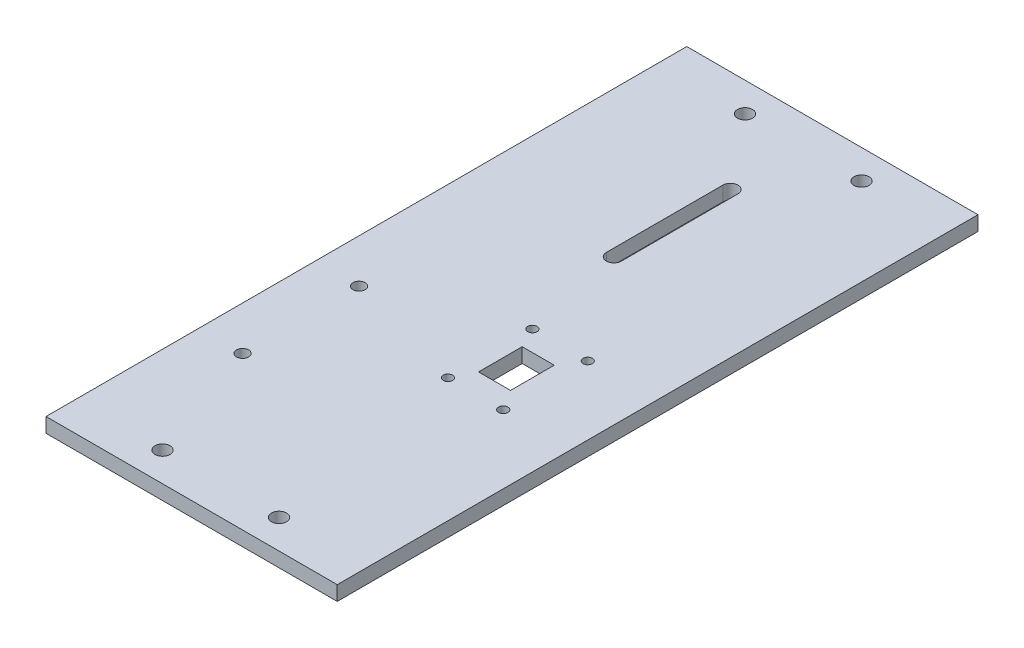
ISO-10303-21;
HEADER;
FILE_DESCRIPTION(('STEP AP214'),'2;1');
FILE_NAME('part.step','',(''),(''),'','','');
FILE_SCHEMA(('AUTOMOTIVE_DESIGN { 1 0 10303 214 1 1 1 1 }'));
ENDSEC;
DATA;
#1=APPLICATION_CONTEXT('core data for automotive mechanical design processes');
#2=APPLICATION_PROTOCOL_DEFINITION('international standard','automotive_design',2000,#1);
#3=PRODUCT_CONTEXT('',#1,'mechanical');
#4=PRODUCT('Part','Part','',(#3));
#5=PRODUCT_RELATED_PRODUCT_CATEGORY('part','',(#4));
#6=PRODUCT_DEFINITION_FORMATION('','',#4);
#7=PRODUCT_DEFINITION_CONTEXT('part definition',#1,'design');
#8=PRODUCT_DEFINITION('design','',#6,#7);
#9=PRODUCT_DEFINITION_SHAPE('','',#8);
#10=(LENGTH_UNIT() NAMED_UNIT(*) SI_UNIT(.MILLI.,.METRE.));
#11=(NAMED_UNIT(*) PLANE_ANGLE_UNIT() SI_UNIT($,.RADIAN.));
#12=(NAMED_UNIT(*) SI_UNIT($,.STERADIAN.) SOLID_ANGLE_UNIT());
#13=UNCERTAINTY_MEASURE_WITH_UNIT(LENGTH_MEASURE(1.E-05),#10,'distance_accuracy_value','');
#14=(GEOMETRIC_REPRESENTATION_CONTEXT(3) GLOBAL_UNCERTAINTY_ASSIGNED_CONTEXT((#13)) GLOBAL_UNIT_ASSIGNED_CONTEXT((#10,
#11,#12)) REPRESENTATION_CONTEXT('',''));
#15=CARTESIAN_POINT('',(0.,0.,0.));
#16=DIRECTION('',(0.,0.,1.));
#17=DIRECTION('',(1.,0.,0.));
#18=AXIS2_PLACEMENT_3D('',#15,#16,#17);
#19=CARTESIAN_POINT('',(50.,5.,110.));
#20=DIRECTION('',(-1.,0.,0.));
#21=DIRECTION('',(0.,0.,1.));
#22=AXIS2_PLACEMENT_3D('',#19,#20,#21);
#23=PLANE('',#22);
#24=DIRECTION('',(0.,0.,-1.));
#25=VECTOR('',#24,1.);
#26=CARTESIAN_POINT('',(50.,0.,110.));
#27=LINE('',#26,#25);
#28=CARTESIAN_POINT('',(50.,0.,110.));
#29=VERTEX_POINT('',#28);
#30=CARTESIAN_POINT('',(50.,0.,-110.));
#31=VERTEX_POINT('',#30);
#32=EDGE_CURVE('E207',#29,#31,#27,.T.);
#33=ORIENTED_EDGE('',*,*,#32,.T.);
#34=DIRECTION('',(0.,-1.,0.));
#35=VECTOR('',#34,1.);
#36=CARTESIAN_POINT('',(50.,5.,-110.));
#37=LINE('',#36,#35);
#38=CARTESIAN_POINT('',(50.,5.,-110.));
#39=VERTEX_POINT('',#38);
#40=EDGE_CURVE('E179',#39,#31,#37,.T.);
#41=ORIENTED_EDGE('',*,*,#40,.F.);
#42=DIRECTION('',(0.,0.,-1.));
#43=VECTOR('',#42,1.);
#44=CARTESIAN_POINT('',(50.,5.,110.));
#45=LINE('',#44,#43);
#46=CARTESIAN_POINT('',(50.,5.,110.));
#47=VERTEX_POINT('',#46);
#48=EDGE_CURVE('E203',#47,#39,#45,.T.);
#49=ORIENTED_EDGE('',*,*,#48,.F.);
#50=DIRECTION('',(0.,-1.,0.));
#51=VECTOR('',#50,1.);
#52=CARTESIAN_POINT('',(50.,5.,110.));
#53=LINE('',#52,#51);
#54=EDGE_CURVE('E196',#47,#29,#53,.T.);
#55=ORIENTED_EDGE('',*,*,#54,.T.);
#56=EDGE_LOOP('',(#33,#41,#49,#55));
#57=FACE_BOUND('',#56,.T.);
#58=ADVANCED_FACE('F40',(#57),#23,.F.);
#59=CARTESIAN_POINT('',(-50.,5.,-110.));
#60=DIRECTION('',(0.,0.,1.));
#61=DIRECTION('',(1.,0.,0.));
#62=AXIS2_PLACEMENT_3D('',#59,#60,#61);
#63=PLANE('',#62);
#64=DIRECTION('',(-1.,0.,0.));
#65=VECTOR('',#64,1.);
#66=CARTESIAN_POINT('',(-50.,0.,-110.));
#67=LINE('',#66,#65);
#68=CARTESIAN_POINT('',(-50.,0.,-110.));
#69=VERTEX_POINT('',#68);
#70=EDGE_CURVE('E205',#31,#69,#67,.T.);
#71=ORIENTED_EDGE('',*,*,#70,.T.);
#72=DIRECTION('',(0.,-1.,0.));
#73=VECTOR('',#72,1.);
#74=CARTESIAN_POINT('',(-50.,5.,-110.));
#75=LINE('',#74,#73);
#76=CARTESIAN_POINT('',(-50.,5.,-110.));
#77=VERTEX_POINT('',#76);
#78=EDGE_CURVE('E190',#77,#69,#75,.T.);
#79=ORIENTED_EDGE('',*,*,#78,.F.);
#80=DIRECTION('',(-1.,0.,0.));
#81=VECTOR('',#80,1.);
#82=CARTESIAN_POINT('',(-50.,5.,-110.));
#83=LINE('',#82,#81);
#84=EDGE_CURVE('E214',#39,#77,#83,.T.);
#85=ORIENTED_EDGE('',*,*,#84,.F.);
#86=ORIENTED_EDGE('',*,*,#40,.T.);
#87=EDGE_LOOP('',(#71,#79,#85,#86));
#88=FACE_BOUND('',#87,.T.);
#89=ADVANCED_FACE('F302',(#88),#63,.F.);
#90=CARTESIAN_POINT('',(-50.,5.,110.));
#91=DIRECTION('',(1.,0.,0.));
#92=DIRECTION('',(0.,0.,-1.));
#93=AXIS2_PLACEMENT_3D('',#90,#91,#92);
#94=PLANE('',#93);
#95=DIRECTION('',(0.,0.,1.));
#96=VECTOR('',#95,1.);
#97=CARTESIAN_POINT('',(-50.,0.,110.));
#98=LINE('',#97,#96);
#99=CARTESIAN_POINT('',(-50.,0.,110.));
#100=VERTEX_POINT('',#99);
#101=EDGE_CURVE('E202',#69,#100,#98,.T.);
#102=ORIENTED_EDGE('',*,*,#101,.T.);
#103=DIRECTION('',(0.,-1.,0.));
#104=VECTOR('',#103,1.);
#105=CARTESIAN_POINT('',(-50.,5.,110.));
#106=LINE('',#105,#104);
#107=CARTESIAN_POINT('',(-50.,5.,110.));
#108=VERTEX_POINT('',#107);
#109=EDGE_CURVE('E193',#108,#100,#106,.T.);
#110=ORIENTED_EDGE('',*,*,#109,.F.);
#111=DIRECTION('',(0.,0.,1.));
#112=VECTOR('',#111,1.);
#113=CARTESIAN_POINT('',(-50.,5.,110.));
#114=LINE('',#113,#112);
#115=EDGE_CURVE('E212',#77,#108,#114,.T.);
#116=ORIENTED_EDGE('',*,*,#115,.F.);
#117=ORIENTED_EDGE('',*,*,#78,.T.);
#118=EDGE_LOOP('',(#102,#110,#116,#117));
#119=FACE_BOUND('',#118,.T.);
#120=ADVANCED_FACE('F309',(#119),#94,.F.);
#121=CARTESIAN_POINT('',(-50.,5.,110.));
#122=DIRECTION('',(0.,0.,-1.));
#123=DIRECTION('',(-1.,0.,0.));
#124=AXIS2_PLACEMENT_3D('',#121,#122,#123);
#125=PLANE('',#124);
#126=DIRECTION('',(1.,0.,0.));
#127=VECTOR('',#126,1.);
#128=CARTESIAN_POINT('',(-50.,0.,110.));
#129=LINE('',#128,#127);
#130=EDGE_CURVE('E200',#100,#29,#129,.T.);
#131=ORIENTED_EDGE('',*,*,#130,.T.);
#132=ORIENTED_EDGE('',*,*,#54,.F.);
#133=DIRECTION('',(1.,0.,0.));
#134=VECTOR('',#133,1.);
#135=CARTESIAN_POINT('',(-50.,5.,110.));
#136=LINE('',#135,#134);
#137=EDGE_CURVE('E199',#108,#47,#136,.T.);
#138=ORIENTED_EDGE('',*,*,#137,.F.);
#139=ORIENTED_EDGE('',*,*,#109,.T.);
#140=EDGE_LOOP('',(#131,#132,#138,#139));
#141=FACE_BOUND('',#140,.T.);
#142=ADVANCED_FACE('F316',(#141),#125,.F.);
#143=CARTESIAN_POINT('',(0.,0.,0.));
#144=DIRECTION('',(0.,-1.,0.));
#145=DIRECTION('',(0.,0.,-1.));
#146=AXIS2_PLACEMENT_3D('',#143,#144,#145);
#147=PLANE('',#146);
#148=CARTESIAN_POINT('',(7.5,0.,29.5));
#149=DIRECTION('',(0.,-1.,0.));
#150=DIRECTION('',(0.,0.,-1.));
#151=AXIS2_PLACEMENT_3D('',#148,#149,#150);
#152=CIRCLE('',#151,1.6);
#153=CARTESIAN_POINT('',(7.5,0.,27.9));
#154=VERTEX_POINT('',#153);
#155=EDGE_CURVE('E585',#154,#154,#152,.F.);
#156=ORIENTED_EDGE('',*,*,#155,.T.);
#157=EDGE_LOOP('',(#156));
#158=FACE_BOUND('',#157,.T.);
#159=CARTESIAN_POINT('',(26.5,0.,0.500000000000011));
#160=DIRECTION('',(0.,-1.,0.));
#161=DIRECTION('',(0.,0.,-1.));
#162=AXIS2_PLACEMENT_3D('',#159,#160,#161);
#163=CIRCLE('',#162,1.6);
#164=CARTESIAN_POINT('',(26.5,0.,-1.09999999999999));
#165=VERTEX_POINT('',#164);
#166=EDGE_CURVE('E569',#165,#165,#163,.F.);
#167=ORIENTED_EDGE('',*,*,#166,.T.);
#168=EDGE_LOOP('',(#167));
#169=FACE_BOUND('',#168,.T.);
#170=CARTESIAN_POINT('',(7.5,0.,0.500000000000011));
#171=DIRECTION('',(0.,-1.,0.));
#172=DIRECTION('',(0.,0.,-1.));
#173=AXIS2_PLACEMENT_3D('',#170,#171,#172);
#174=CIRCLE('',#173,1.6);
#175=CARTESIAN_POINT('',(7.5,0.,-1.09999999999999));
#176=VERTEX_POINT('',#175);
#177=EDGE_CURVE('E573',#176,#176,#174,.F.);
#178=ORIENTED_EDGE('',*,*,#177,.T.);
#179=EDGE_LOOP('',(#178));
#180=FACE_BOUND('',#179,.T.);
#181=CARTESIAN_POINT('',(26.5,0.,29.5));
#182=DIRECTION('',(0.,-1.,0.));
#183=DIRECTION('',(0.,0.,-1.));
#184=AXIS2_PLACEMENT_3D('',#181,#182,#183);
#185=CIRCLE('',#184,1.6);
#186=CARTESIAN_POINT('',(26.5,0.,27.9));
#187=VERTEX_POINT('',#186);
#188=EDGE_CURVE('E583',#187,#187,#185,.F.);
#189=ORIENTED_EDGE('',*,*,#188,.T.);
#190=EDGE_LOOP('',(#189));
#191=FACE_BOUND('',#190,.T.);
#192=DIRECTION('',(0.,0.,-1.));
#193=VECTOR('',#192,1.);
#194=CARTESIAN_POINT('',(-2.6,0.,-35.));
#195=LINE('',#194,#193);
#196=CARTESIAN_POINT('',(-2.6,0.,-35.));
#197=VERTEX_POINT('',#196);
#198=CARTESIAN_POINT('',(-2.59999999999999,0.,-75.));
#199=VERTEX_POINT('',#198);
#200=EDGE_CURVE('E130',#197,#199,#195,.T.);
#201=ORIENTED_EDGE('',*,*,#200,.F.);
#202=CARTESIAN_POINT('',(0.,0.,-35.));
#203=DIRECTION('',(0.,-1.,0.));
#204=DIRECTION('',(0.,0.,-1.));
#205=AXIS2_PLACEMENT_3D('',#202,#203,#204);
#206=CIRCLE('',#205,2.6);
#207=CARTESIAN_POINT('',(2.6,0.,-35.));
#208=VERTEX_POINT('',#207);
#209=EDGE_CURVE('E135',#208,#197,#206,.T.);
#210=ORIENTED_EDGE('',*,*,#209,.F.);
#211=DIRECTION('',(0.,0.,1.));
#212=VECTOR('',#211,1.);
#213=CARTESIAN_POINT('',(2.6,0.,-35.));
#214=LINE('',#213,#212);
#215=CARTESIAN_POINT('',(2.6,0.,-75.));
#216=VERTEX_POINT('',#215);
#217=EDGE_CURVE('E141',#216,#208,#214,.T.);
#218=ORIENTED_EDGE('',*,*,#217,.F.);
#219=CARTESIAN_POINT('',(0.,0.,-75.));
#220=DIRECTION('',(0.,-1.,0.));
#221=DIRECTION('',(0.,0.,-1.));
#222=AXIS2_PLACEMENT_3D('',#219,#220,#221);
#223=CIRCLE('',#222,2.6);
#224=EDGE_CURVE('E137',#199,#216,#223,.T.);
#225=ORIENTED_EDGE('',*,*,#224,.F.);
#226=EDGE_LOOP('',(#201,#210,#218,#225));
#227=FACE_BOUND('',#226,.T.);
#228=CARTESIAN_POINT('',(-35.,0.,57.5));
#229=DIRECTION('',(0.,-1.,0.));
#230=DIRECTION('',(0.,0.,-1.));
#231=AXIS2_PLACEMENT_3D('',#228,#229,#230);
#232=CIRCLE('',#231,2.1);
#233=CARTESIAN_POINT('',(-35.,0.,55.4));
#234=VERTEX_POINT('',#233);
#235=EDGE_CURVE('E180',#234,#234,#232,.F.);
#236=ORIENTED_EDGE('',*,*,#235,.T.);
#237=EDGE_LOOP('',(#236));
#238=FACE_BOUND('',#237,.T.);
#239=CARTESIAN_POINT('',(-35.,0.,17.5));
#240=DIRECTION('',(0.,-1.,0.));
#241=DIRECTION('',(0.,0.,-1.));
#242=AXIS2_PLACEMENT_3D('',#239,#240,#241);
#243=CIRCLE('',#242,2.1);
#244=CARTESIAN_POINT('',(-35.,0.,15.4));
#245=VERTEX_POINT('',#244);
#246=EDGE_CURVE('E183',#245,#245,#243,.F.);
#247=ORIENTED_EDGE('',*,*,#246,.T.);
#248=EDGE_LOOP('',(#247));
#249=FACE_BOUND('',#248,.T.);
#250=DIRECTION('',(0.,0.,-1.));
#251=VECTOR('',#250,1.);
#252=CARTESIAN_POINT('',(22.,0.,7.50000000000002));
#253=LINE('',#252,#251);
#254=CARTESIAN_POINT('',(22.,0.,22.5));
#255=VERTEX_POINT('',#254);
#256=CARTESIAN_POINT('',(22.,0.,7.50000000000002));
#257=VERTEX_POINT('',#256);
#258=EDGE_CURVE('E261',#255,#257,#253,.T.);
#259=ORIENTED_EDGE('',*,*,#258,.T.);
#260=DIRECTION('',(-1.,0.,0.));
#261=VECTOR('',#260,1.);
#262=CARTESIAN_POINT('',(11.,0.,7.50000000000003));
#263=LINE('',#262,#261);
#264=CARTESIAN_POINT('',(11.,0.,7.50000000000003));
#265=VERTEX_POINT('',#264);
#266=EDGE_CURVE('E55',#257,#265,#263,.T.);
#267=ORIENTED_EDGE('',*,*,#266,.T.);
#268=DIRECTION('',(0.,0.,1.));
#269=VECTOR('',#268,1.);
#270=CARTESIAN_POINT('',(11.,0.,7.50000000000003));
#271=LINE('',#270,#269);
#272=CARTESIAN_POINT('',(11.,0.,22.5));
#273=VERTEX_POINT('',#272);
#274=EDGE_CURVE('E11',#265,#273,#271,.T.);
#275=ORIENTED_EDGE('',*,*,#274,.T.);
#276=DIRECTION('',(1.,0.,0.));
#277=VECTOR('',#276,1.);
#278=CARTESIAN_POINT('',(11.,0.,22.5));
#279=LINE('',#278,#277);
#280=EDGE_CURVE('E48',#273,#255,#279,.T.);
#281=ORIENTED_EDGE('',*,*,#280,.T.);
#282=EDGE_LOOP('',(#259,#267,#275,#281));
#283=FACE_BOUND('',#282,.T.);
#284=CARTESIAN_POINT('',(-20.,0.,100.));
#285=DIRECTION('',(0.,-1.,0.));
#286=DIRECTION('',(0.,0.,-1.));
#287=AXIS2_PLACEMENT_3D('',#284,#285,#286);
#288=CIRCLE('',#287,2.6);
#289=CARTESIAN_POINT('',(-20.,0.,97.4));
#290=VERTEX_POINT('',#289);
#291=EDGE_CURVE('E221',#290,#290,#288,.F.);
#292=ORIENTED_EDGE('',*,*,#291,.T.);
#293=EDGE_LOOP('',(#292));
#294=FACE_BOUND('',#293,.T.);
#295=CARTESIAN_POINT('',(20.,0.,-100.));
#296=DIRECTION('',(0.,-1.,0.));
#297=DIRECTION('',(0.,0.,-1.));
#298=AXIS2_PLACEMENT_3D('',#295,#296,#297);
#299=CIRCLE('',#298,2.6);
#300=CARTESIAN_POINT('',(20.,0.,-102.6));
#301=VERTEX_POINT('',#300);
#302=EDGE_CURVE('E228',#301,#301,#299,.F.);
#303=ORIENTED_EDGE('',*,*,#302,.T.);
#304=EDGE_LOOP('',(#303));
#305=FACE_BOUND('',#304,.T.);
#306=CARTESIAN_POINT('',(20.0000000000001,0.,100.));
#307=DIRECTION('',(0.,-1.,0.));
#308=DIRECTION('',(0.,0.,-1.));
#309=AXIS2_PLACEMENT_3D('',#306,#307,#308);
#310=CIRCLE('',#309,2.6);
#311=CARTESIAN_POINT('',(20.0000000000001,0.,97.4));
#312=VERTEX_POINT('',#311);
#313=EDGE_CURVE('E227',#312,#312,#310,.F.);
#314=ORIENTED_EDGE('',*,*,#313,.T.);
#315=EDGE_LOOP('',(#314));
#316=FACE_BOUND('',#315,.T.);
#317=CARTESIAN_POINT('',(-20.,0.,-100.));
#318=DIRECTION('',(0.,-1.,0.));
#319=DIRECTION('',(0.,0.,-1.));
#320=AXIS2_PLACEMENT_3D('',#317,#318,#319);
#321=CIRCLE('',#320,2.6);
#322=CARTESIAN_POINT('',(-20.,0.,-102.6));
#323=VERTEX_POINT('',#322);
#324=EDGE_CURVE('E218',#323,#323,#321,.F.);
#325=ORIENTED_EDGE('',*,*,#324,.T.);
#326=EDGE_LOOP('',(#325));
#327=FACE_BOUND('',#326,.T.);
#328=ORIENTED_EDGE('',*,*,#32,.F.);
#329=ORIENTED_EDGE('',*,*,#130,.F.);
#330=ORIENTED_EDGE('',*,*,#101,.F.);
#331=ORIENTED_EDGE('',*,*,#70,.F.);
#332=EDGE_LOOP('',(#328,#329,#330,#331));
#333=FACE_BOUND('',#332,.T.);
#334=ADVANCED_FACE('F132',(#158,#169,#180,#191,#227,#238,#249,#283,#294,#305,#316,#327,#333),
#147,.T.);
#335=CARTESIAN_POINT('',(-20.,-0.00100000000000013,-100.));
#336=DIRECTION('',(0.,1.,0.));
#337=DIRECTION('',(0.,0.,1.));
#338=AXIS2_PLACEMENT_3D('',#335,#336,#337);
#339=CYLINDRICAL_SURFACE('',#338,2.6);
#340=ORIENTED_EDGE('',*,*,#324,.F.);
#341=EDGE_LOOP('',(#340));
#342=FACE_BOUND('',#341,.T.);
#343=CARTESIAN_POINT('',(-20.,5.,-100.));
#344=DIRECTION('',(0.,1.,0.));
#345=DIRECTION('',(0.,0.,1.));
#346=AXIS2_PLACEMENT_3D('',#343,#344,#345);
#347=CIRCLE('',#346,2.6);
#348=CARTESIAN_POINT('',(-20.,5.,-97.4));
#349=VERTEX_POINT('',#348);
#350=EDGE_CURVE('E210',#349,#349,#347,.T.);
#351=ORIENTED_EDGE('',*,*,#350,.T.);
#352=EDGE_LOOP('',(#351));
#353=FACE_BOUND('',#352,.T.);
#354=ADVANCED_FACE('F323',(#342,#353),#339,.F.);
#355=CARTESIAN_POINT('',(20.0000000000001,-0.00100000000000013,100.));
#356=DIRECTION('',(0.,1.,0.));
#357=DIRECTION('',(0.,0.,1.));
#358=AXIS2_PLACEMENT_3D('',#355,#356,#357);
#359=CYLINDRICAL_SURFACE('',#358,2.6);
#360=ORIENTED_EDGE('',*,*,#313,.F.);
#361=EDGE_LOOP('',(#360));
#362=FACE_BOUND('',#361,.T.);
#363=CARTESIAN_POINT('',(20.0000000000001,5.,100.));
#364=DIRECTION('',(0.,1.,0.));
#365=DIRECTION('',(0.,0.,1.));
#366=AXIS2_PLACEMENT_3D('',#363,#364,#365);
#367=CIRCLE('',#366,2.6);
#368=CARTESIAN_POINT('',(20.0000000000001,5.,102.6));
#369=VERTEX_POINT('',#368);
#370=EDGE_CURVE('E236',#369,#369,#367,.T.);
#371=ORIENTED_EDGE('',*,*,#370,.T.);
#372=EDGE_LOOP('',(#371));
#373=FACE_BOUND('',#372,.T.);
#374=ADVANCED_FACE('F327',(#362,#373),#359,.F.);
#375=CARTESIAN_POINT('',(20.,-0.00100000000000013,-100.));
#376=DIRECTION('',(0.,1.,0.));
#377=DIRECTION('',(0.,0.,1.));
#378=AXIS2_PLACEMENT_3D('',#375,#376,#377);
#379=CYLINDRICAL_SURFACE('',#378,2.6);
#380=ORIENTED_EDGE('',*,*,#302,.F.);
#381=EDGE_LOOP('',(#380));
#382=FACE_BOUND('',#381,.T.);
#383=CARTESIAN_POINT('',(20.,5.,-100.));
#384=DIRECTION('',(0.,1.,0.));
#385=DIRECTION('',(0.,0.,1.));
#386=AXIS2_PLACEMENT_3D('',#383,#384,#385);
#387=CIRCLE('',#386,2.6);
#388=CARTESIAN_POINT('',(20.,5.,-97.4));
#389=VERTEX_POINT('',#388);
#390=EDGE_CURVE('E224',#389,#389,#387,.T.);
#391=ORIENTED_EDGE('',*,*,#390,.T.);
#392=EDGE_LOOP('',(#391));
#393=FACE_BOUND('',#392,.T.);
#394=ADVANCED_FACE('F329',(#382,#393),#379,.F.);
#395=CARTESIAN_POINT('',(-20.,-0.00100000000000013,100.));
#396=DIRECTION('',(0.,1.,0.));
#397=DIRECTION('',(0.,0.,1.));
#398=AXIS2_PLACEMENT_3D('',#395,#396,#397);
#399=CYLINDRICAL_SURFACE('',#398,2.6);
#400=ORIENTED_EDGE('',*,*,#291,.F.);
#401=EDGE_LOOP('',(#400));
#402=FACE_BOUND('',#401,.T.);
#403=CARTESIAN_POINT('',(-20.,5.,100.));
#404=DIRECTION('',(0.,1.,0.));
#405=DIRECTION('',(0.,0.,1.));
#406=AXIS2_PLACEMENT_3D('',#403,#404,#405);
#407=CIRCLE('',#406,2.6);
#408=CARTESIAN_POINT('',(-20.,5.,102.6));
#409=VERTEX_POINT('',#408);
#410=EDGE_CURVE('E231',#409,#409,#407,.T.);
#411=ORIENTED_EDGE('',*,*,#410,.T.);
#412=EDGE_LOOP('',(#411));
#413=FACE_BOUND('',#412,.T.);
#414=ADVANCED_FACE('F332',(#402,#413),#399,.F.);
#415=CARTESIAN_POINT('',(22.,-0.00100000000000013,7.50000000000002));
#416=DIRECTION('',(1.,0.,0.));
#417=DIRECTION('',(0.,0.,-1.));
#418=AXIS2_PLACEMENT_3D('',#415,#416,#417);
#419=PLANE('',#418);
#420=DIRECTION('',(0.,1.,0.));
#421=VECTOR('',#420,1.);
#422=CARTESIAN_POINT('',(22.,-0.00100000000000013,22.5));
#423=LINE('',#422,#421);
#424=CARTESIAN_POINT('',(22.,5.,22.5));
#425=VERTEX_POINT('',#424);
#426=EDGE_CURVE('E242',#255,#425,#423,.T.);
#427=ORIENTED_EDGE('',*,*,#426,.T.);
#428=DIRECTION('',(0.,0.,-1.));
#429=VECTOR('',#428,1.);
#430=CARTESIAN_POINT('',(22.,5.,7.50000000000002));
#431=LINE('',#430,#429);
#432=CARTESIAN_POINT('',(22.,5.,7.50000000000002));
#433=VERTEX_POINT('',#432);
#434=EDGE_CURVE('E259',#425,#433,#431,.T.);
#435=ORIENTED_EDGE('',*,*,#434,.T.);
#436=DIRECTION('',(0.,1.,0.));
#437=VECTOR('',#436,1.);
#438=CARTESIAN_POINT('',(22.,-0.00100000000000013,7.50000000000002));
#439=LINE('',#438,#437);
#440=EDGE_CURVE('E243',#257,#433,#439,.T.);
#441=ORIENTED_EDGE('',*,*,#440,.F.);
#442=ORIENTED_EDGE('',*,*,#258,.F.);
#443=EDGE_LOOP('',(#427,#435,#441,#442));
#444=FACE_BOUND('',#443,.T.);
#445=ADVANCED_FACE('F276',(#444),#419,.F.);
#446=CARTESIAN_POINT('',(11.,-0.00100000000000013,22.5));
#447=DIRECTION('',(0.,0.,1.));
#448=DIRECTION('',(1.,0.,0.));
#449=AXIS2_PLACEMENT_3D('',#446,#447,#448);
#450=PLANE('',#449);
#451=DIRECTION('',(0.,1.,0.));
#452=VECTOR('',#451,1.);
#453=CARTESIAN_POINT('',(11.,-0.00100000000000013,22.5));
#454=LINE('',#453,#452);
#455=CARTESIAN_POINT('',(11.,5.,22.5));
#456=VERTEX_POINT('',#455);
#457=EDGE_CURVE('E248',#273,#456,#454,.T.);
#458=ORIENTED_EDGE('',*,*,#457,.T.);
#459=DIRECTION('',(1.,0.,0.));
#460=VECTOR('',#459,1.);
#461=CARTESIAN_POINT('',(11.,5.,22.5));
#462=LINE('',#461,#460);
#463=EDGE_CURVE('E245',#456,#425,#462,.T.);
#464=ORIENTED_EDGE('',*,*,#463,.T.);
#465=ORIENTED_EDGE('',*,*,#426,.F.);
#466=ORIENTED_EDGE('',*,*,#280,.F.);
#467=EDGE_LOOP('',(#458,#464,#465,#466));
#468=FACE_BOUND('',#467,.T.);
#469=ADVANCED_FACE('F270',(#468),#450,.F.);
#470=CARTESIAN_POINT('',(11.,-0.00100000000000013,7.50000000000003));
#471=DIRECTION('',(-1.,0.,0.));
#472=DIRECTION('',(0.,0.,1.));
#473=AXIS2_PLACEMENT_3D('',#470,#471,#472);
#474=PLANE('',#473);
#475=DIRECTION('',(0.,1.,0.));
#476=VECTOR('',#475,1.);
#477=CARTESIAN_POINT('',(11.,-0.00100000000000013,7.50000000000003));
#478=LINE('',#477,#476);
#479=CARTESIAN_POINT('',(11.,5.,7.50000000000003));
#480=VERTEX_POINT('',#479);
#481=EDGE_CURVE('E246',#265,#480,#478,.T.);
#482=ORIENTED_EDGE('',*,*,#481,.T.);
#483=DIRECTION('',(0.,0.,1.));
#484=VECTOR('',#483,1.);
#485=CARTESIAN_POINT('',(11.,5.,7.50000000000003));
#486=LINE('',#485,#484);
#487=EDGE_CURVE('E253',#480,#456,#486,.T.);
#488=ORIENTED_EDGE('',*,*,#487,.T.);
#489=ORIENTED_EDGE('',*,*,#457,.F.);
#490=ORIENTED_EDGE('',*,*,#274,.F.);
#491=EDGE_LOOP('',(#482,#488,#489,#490));
#492=FACE_BOUND('',#491,.T.);
#493=ADVANCED_FACE('F267',(#492),#474,.F.);
#494=CARTESIAN_POINT('',(11.,-0.00100000000000013,7.50000000000003));
#495=DIRECTION('',(0.,0.,-1.));
#496=DIRECTION('',(-1.,0.,0.));
#497=AXIS2_PLACEMENT_3D('',#494,#495,#496);
#498=PLANE('',#497);
#499=ORIENTED_EDGE('',*,*,#440,.T.);
#500=DIRECTION('',(-1.,0.,0.));
#501=VECTOR('',#500,1.);
#502=CARTESIAN_POINT('',(11.,5.,7.50000000000003));
#503=LINE('',#502,#501);
#504=EDGE_CURVE('E256',#433,#480,#503,.T.);
#505=ORIENTED_EDGE('',*,*,#504,.T.);
#506=ORIENTED_EDGE('',*,*,#481,.F.);
#507=ORIENTED_EDGE('',*,*,#266,.F.);
#508=EDGE_LOOP('',(#499,#505,#506,#507));
#509=FACE_BOUND('',#508,.T.);
#510=ADVANCED_FACE('F277',(#509),#498,.F.);
#511=CARTESIAN_POINT('',(-35.,-0.00100000000000013,17.5));
#512=DIRECTION('',(0.,1.,0.));
#513=DIRECTION('',(0.,0.,1.));
#514=AXIS2_PLACEMENT_3D('',#511,#512,#513);
#515=CYLINDRICAL_SURFACE('',#514,2.1);
#516=ORIENTED_EDGE('',*,*,#246,.F.);
#517=EDGE_LOOP('',(#516));
#518=FACE_BOUND('',#517,.T.);
#519=CARTESIAN_POINT('',(-35.,5.,17.5));
#520=DIRECTION('',(0.,1.,0.));
#521=DIRECTION('',(0.,0.,1.));
#522=AXIS2_PLACEMENT_3D('',#519,#520,#521);
#523=CIRCLE('',#522,2.1);
#524=CARTESIAN_POINT('',(-35.,5.,19.6));
#525=VERTEX_POINT('',#524);
#526=EDGE_CURVE('E175',#525,#525,#523,.T.);
#527=ORIENTED_EDGE('',*,*,#526,.T.);
#528=EDGE_LOOP('',(#527));
#529=FACE_BOUND('',#528,.T.);
#530=ADVANCED_FACE('F279',(#518,#529),#515,.F.);
#531=CARTESIAN_POINT('',(-35.,-0.00100000000000013,57.5));
#532=DIRECTION('',(0.,1.,0.));
#533=DIRECTION('',(0.,0.,1.));
#534=AXIS2_PLACEMENT_3D('',#531,#532,#533);
#535=CYLINDRICAL_SURFACE('',#534,2.1);
#536=ORIENTED_EDGE('',*,*,#235,.F.);
#537=EDGE_LOOP('',(#536));
#538=FACE_BOUND('',#537,.T.);
#539=CARTESIAN_POINT('',(-35.,5.,57.5));
#540=DIRECTION('',(0.,1.,0.));
#541=DIRECTION('',(0.,0.,1.));
#542=AXIS2_PLACEMENT_3D('',#539,#540,#541);
#543=CIRCLE('',#542,2.1);
#544=CARTESIAN_POINT('',(-35.,5.,59.6));
#545=VERTEX_POINT('',#544);
#546=EDGE_CURVE('E176',#545,#545,#543,.T.);
#547=ORIENTED_EDGE('',*,*,#546,.T.);
#548=EDGE_LOOP('',(#547));
#549=FACE_BOUND('',#548,.T.);
#550=ADVANCED_FACE('F285',(#538,#549),#535,.F.);
#551=CARTESIAN_POINT('',(2.6,30.001,-35.));
#552=DIRECTION('',(1.,0.,0.));
#553=DIRECTION('',(0.,0.,-1.));
#554=AXIS2_PLACEMENT_3D('',#551,#552,#553);
#555=PLANE('',#554);
#556=ORIENTED_EDGE('',*,*,#217,.T.);
#557=DIRECTION('',(0.,-1.,0.));
#558=VECTOR('',#557,1.);
#559=CARTESIAN_POINT('',(2.6,30.001,-35.));
#560=LINE('',#559,#558);
#561=CARTESIAN_POINT('',(2.6,5.,-35.));
#562=VERTEX_POINT('',#561);
#563=EDGE_CURVE('E152',#562,#208,#560,.T.);
#564=ORIENTED_EDGE('',*,*,#563,.F.);
#565=DIRECTION('',(0.,0.,1.));
#566=VECTOR('',#565,1.);
#567=CARTESIAN_POINT('',(2.6,5.,-35.));
#568=LINE('',#567,#566);
#569=CARTESIAN_POINT('',(2.6,5.,-75.));
#570=VERTEX_POINT('',#569);
#571=EDGE_CURVE('E142',#570,#562,#568,.T.);
#572=ORIENTED_EDGE('',*,*,#571,.F.);
#573=DIRECTION('',(0.,-1.,0.));
#574=VECTOR('',#573,1.);
#575=CARTESIAN_POINT('',(2.6,30.001,-75.));
#576=LINE('',#575,#574);
#577=EDGE_CURVE('E167',#570,#216,#576,.T.);
#578=ORIENTED_EDGE('',*,*,#577,.T.);
#579=EDGE_LOOP('',(#556,#564,#572,#578));
#580=FACE_BOUND('',#579,.T.);
#581=ADVANCED_FACE('F374',(#580),#555,.F.);
#582=CARTESIAN_POINT('',(-2.6,30.001,-35.));
#583=DIRECTION('',(-1.,0.,0.));
#584=DIRECTION('',(0.,0.,1.));
#585=AXIS2_PLACEMENT_3D('',#582,#583,#584);
#586=PLANE('',#585);
#587=DIRECTION('',(0.,0.,-1.));
#588=VECTOR('',#587,1.);
#589=CARTESIAN_POINT('',(-2.6,5.,-35.));
#590=LINE('',#589,#588);
#591=CARTESIAN_POINT('',(-2.6,5.,-35.));
#592=VERTEX_POINT('',#591);
#593=CARTESIAN_POINT('',(-2.59999999999999,5.,-75.));
#594=VERTEX_POINT('',#593);
#595=EDGE_CURVE('E147',#592,#594,#590,.T.);
#596=ORIENTED_EDGE('',*,*,#595,.F.);
#597=DIRECTION('',(0.,-1.,0.));
#598=VECTOR('',#597,1.);
#599=CARTESIAN_POINT('',(-2.6,30.001,-35.));
#600=LINE('',#599,#598);
#601=EDGE_CURVE('E145',#592,#197,#600,.T.);
#602=ORIENTED_EDGE('',*,*,#601,.T.);
#603=ORIENTED_EDGE('',*,*,#200,.T.);
#604=DIRECTION('',(0.,-1.,0.));
#605=VECTOR('',#604,1.);
#606=CARTESIAN_POINT('',(-2.59999999999999,30.001,-75.));
#607=LINE('',#606,#605);
#608=EDGE_CURVE('E166',#594,#199,#607,.T.);
#609=ORIENTED_EDGE('',*,*,#608,.F.);
#610=EDGE_LOOP('',(#596,#602,#603,#609));
#611=FACE_BOUND('',#610,.T.);
#612=ADVANCED_FACE('F146',(#611),#586,.F.);
#613=CARTESIAN_POINT('',(0.,30.001,-75.));
#614=DIRECTION('',(0.,-1.,0.));
#615=DIRECTION('',(0.,0.,-1.));
#616=AXIS2_PLACEMENT_3D('',#613,#614,#615);
#617=CYLINDRICAL_SURFACE('',#616,2.6);
#618=ORIENTED_EDGE('',*,*,#608,.T.);
#619=ORIENTED_EDGE('',*,*,#224,.T.);
#620=ORIENTED_EDGE('',*,*,#577,.F.);
#621=CARTESIAN_POINT('',(0.,5.,-75.));
#622=DIRECTION('',(0.,1.,0.));
#623=DIRECTION('',(0.,0.,1.));
#624=AXIS2_PLACEMENT_3D('',#621,#622,#623);
#625=CIRCLE('',#624,2.6);
#626=EDGE_CURVE('E163',#594,#570,#625,.F.);
#627=ORIENTED_EDGE('',*,*,#626,.F.);
#628=EDGE_LOOP('',(#618,#619,#620,#627));
#629=FACE_BOUND('',#628,.T.);
#630=ADVANCED_FACE('F400',(#629),#617,.F.);
#631=CARTESIAN_POINT('',(0.,30.001,-35.));
#632=DIRECTION('',(0.,-1.,0.));
#633=DIRECTION('',(0.,0.,-1.));
#634=AXIS2_PLACEMENT_3D('',#631,#632,#633);
#635=CYLINDRICAL_SURFACE('',#634,2.6);
#636=ORIENTED_EDGE('',*,*,#563,.T.);
#637=ORIENTED_EDGE('',*,*,#209,.T.);
#638=ORIENTED_EDGE('',*,*,#601,.F.);
#639=CARTESIAN_POINT('',(0.,5.,-35.));
#640=DIRECTION('',(0.,1.,0.));
#641=DIRECTION('',(0.,0.,1.));
#642=AXIS2_PLACEMENT_3D('',#639,#640,#641);
#643=CIRCLE('',#642,2.6);
#644=EDGE_CURVE('E151',#562,#592,#643,.F.);
#645=ORIENTED_EDGE('',*,*,#644,.F.);
#646=EDGE_LOOP('',(#636,#637,#638,#645));
#647=FACE_BOUND('',#646,.T.);
#648=ADVANCED_FACE('F155',(#647),#635,.F.);
#649=CARTESIAN_POINT('',(26.5,-0.00100000000000013,29.5));
#650=DIRECTION('',(0.,1.,0.));
#651=DIRECTION('',(0.,0.,1.));
#652=AXIS2_PLACEMENT_3D('',#649,#650,#651);
#653=CYLINDRICAL_SURFACE('',#652,1.6);
#654=ORIENTED_EDGE('',*,*,#188,.F.);
#655=EDGE_LOOP('',(#654));
#656=FACE_BOUND('',#655,.T.);
#657=CARTESIAN_POINT('',(26.5,5.,29.5));
#658=DIRECTION('',(0.,1.,0.));
#659=DIRECTION('',(0.,0.,1.));
#660=AXIS2_PLACEMENT_3D('',#657,#658,#659);
#661=CIRCLE('',#660,1.6);
#662=CARTESIAN_POINT('',(26.5,5.,31.1));
#663=VERTEX_POINT('',#662);
#664=EDGE_CURVE('E171',#663,#663,#661,.T.);
#665=ORIENTED_EDGE('',*,*,#664,.T.);
#666=EDGE_LOOP('',(#665));
#667=FACE_BOUND('',#666,.T.);
#668=ADVANCED_FACE('F426',(#656,#667),#653,.F.);
#669=CARTESIAN_POINT('',(7.5,-0.00100000000000013,0.500000000000011));
#670=DIRECTION('',(0.,1.,0.));
#671=DIRECTION('',(0.,0.,1.));
#672=AXIS2_PLACEMENT_3D('',#669,#670,#671);
#673=CYLINDRICAL_SURFACE('',#672,1.6);
#674=ORIENTED_EDGE('',*,*,#177,.F.);
#675=EDGE_LOOP('',(#674));
#676=FACE_BOUND('',#675,.T.);
#677=CARTESIAN_POINT('',(7.5,5.,0.500000000000011));
#678=DIRECTION('',(0.,1.,0.));
#679=DIRECTION('',(0.,0.,1.));
#680=AXIS2_PLACEMENT_3D('',#677,#678,#679);
#681=CIRCLE('',#680,1.6);
#682=CARTESIAN_POINT('',(7.5,5.,2.10000000000001));
#683=VERTEX_POINT('',#682);
#684=EDGE_CURVE('E578',#683,#683,#681,.T.);
#685=ORIENTED_EDGE('',*,*,#684,.T.);
#686=EDGE_LOOP('',(#685));
#687=FACE_BOUND('',#686,.T.);
#688=ADVANCED_FACE('F436',(#676,#687),#673,.F.);
#689=CARTESIAN_POINT('',(26.5,-0.00100000000000013,0.500000000000011));
#690=DIRECTION('',(0.,1.,0.));
#691=DIRECTION('',(0.,0.,1.));
#692=AXIS2_PLACEMENT_3D('',#689,#690,#691);
#693=CYLINDRICAL_SURFACE('',#692,1.6);
#694=ORIENTED_EDGE('',*,*,#166,.F.);
#695=EDGE_LOOP('',(#694));
#696=FACE_BOUND('',#695,.T.);
#697=CARTESIAN_POINT('',(26.5,5.,0.500000000000011));
#698=DIRECTION('',(0.,1.,0.));
#699=DIRECTION('',(0.,0.,1.));
#700=AXIS2_PLACEMENT_3D('',#697,#698,#699);
#701=CIRCLE('',#700,1.6);
#702=CARTESIAN_POINT('',(26.5,5.,2.10000000000001));
#703=VERTEX_POINT('',#702);
#704=EDGE_CURVE('E572',#703,#703,#701,.T.);
#705=ORIENTED_EDGE('',*,*,#704,.T.);
#706=EDGE_LOOP('',(#705));
#707=FACE_BOUND('',#706,.T.);
#708=ADVANCED_FACE('F296',(#696,#707),#693,.F.);
#709=CARTESIAN_POINT('',(7.5,-0.00100000000000013,29.5));
#710=DIRECTION('',(0.,1.,0.));
#711=DIRECTION('',(0.,0.,1.));
#712=AXIS2_PLACEMENT_3D('',#709,#710,#711);
#713=CYLINDRICAL_SURFACE('',#712,1.6);
#714=ORIENTED_EDGE('',*,*,#155,.F.);
#715=EDGE_LOOP('',(#714));
#716=FACE_BOUND('',#715,.T.);
#717=CARTESIAN_POINT('',(7.5,5.,29.5));
#718=DIRECTION('',(0.,1.,0.));
#719=DIRECTION('',(0.,0.,1.));
#720=AXIS2_PLACEMENT_3D('',#717,#718,#719);
#721=CIRCLE('',#720,1.6);
#722=CARTESIAN_POINT('',(7.5,5.,31.1));
#723=VERTEX_POINT('',#722);
#724=EDGE_CURVE('E575',#723,#723,#721,.T.);
#725=ORIENTED_EDGE('',*,*,#724,.T.);
#726=EDGE_LOOP('',(#725));
#727=FACE_BOUND('',#726,.T.);
#728=ADVANCED_FACE('F291',(#716,#727),#713,.F.);
#729=CARTESIAN_POINT('',(50.,5.,-110.));
#730=DIRECTION('',(0.,1.,0.));
#731=DIRECTION('',(0.,0.,1.));
#732=AXIS2_PLACEMENT_3D('',#729,#730,#731);
#733=PLANE('',#732);
#734=ORIENTED_EDGE('',*,*,#724,.F.);
#735=EDGE_LOOP('',(#734));
#736=FACE_BOUND('',#735,.T.);
#737=ORIENTED_EDGE('',*,*,#704,.F.);
#738=EDGE_LOOP('',(#737));
#739=FACE_BOUND('',#738,.T.);
#740=ORIENTED_EDGE('',*,*,#684,.F.);
#741=EDGE_LOOP('',(#740));
#742=FACE_BOUND('',#741,.T.);
#743=ORIENTED_EDGE('',*,*,#664,.F.);
#744=EDGE_LOOP('',(#743));
#745=FACE_BOUND('',#744,.T.);
#746=ORIENTED_EDGE('',*,*,#644,.T.);
#747=ORIENTED_EDGE('',*,*,#595,.T.);
#748=ORIENTED_EDGE('',*,*,#626,.T.);
#749=ORIENTED_EDGE('',*,*,#571,.T.);
#750=EDGE_LOOP('',(#746,#747,#748,#749));
#751=FACE_BOUND('',#750,.T.);
#752=ORIENTED_EDGE('',*,*,#546,.F.);
#753=EDGE_LOOP('',(#752));
#754=FACE_BOUND('',#753,.T.);
#755=ORIENTED_EDGE('',*,*,#526,.F.);
#756=EDGE_LOOP('',(#755));
#757=FACE_BOUND('',#756,.T.);
#758=ORIENTED_EDGE('',*,*,#504,.F.);
#759=ORIENTED_EDGE('',*,*,#434,.F.);
#760=ORIENTED_EDGE('',*,*,#463,.F.);
#761=ORIENTED_EDGE('',*,*,#487,.F.);
#762=EDGE_LOOP('',(#758,#759,#760,#761));
#763=FACE_BOUND('',#762,.T.);
#764=ORIENTED_EDGE('',*,*,#410,.F.);
#765=EDGE_LOOP('',(#764));
#766=FACE_BOUND('',#765,.T.);
#767=ORIENTED_EDGE('',*,*,#390,.F.);
#768=EDGE_LOOP('',(#767));
#769=FACE_BOUND('',#768,.T.);
#770=ORIENTED_EDGE('',*,*,#370,.F.);
#771=EDGE_LOOP('',(#770));
#772=FACE_BOUND('',#771,.T.);
#773=ORIENTED_EDGE('',*,*,#350,.F.);
#774=EDGE_LOOP('',(#773));
#775=FACE_BOUND('',#774,.T.);
#776=ORIENTED_EDGE('',*,*,#48,.T.);
#777=ORIENTED_EDGE('',*,*,#84,.T.);
#778=ORIENTED_EDGE('',*,*,#115,.T.);
#779=ORIENTED_EDGE('',*,*,#137,.T.);
#780=EDGE_LOOP('',(#776,#777,#778,#779));
#781=FACE_BOUND('',#780,.T.);
#782=ADVANCED_FACE('F42',(#736,#739,#742,#745,#751,#754,#757,#763,#766,#769,#772,#775,#781),
#733,.T.);
#783=CLOSED_SHELL('',(#58,#89,#120,#142,#334,#354,#374,#394,#414,#445,#469,#493,#510,#530,#550,
#581,#612,#630,#648,#668,#688,#708,#728,#782));
#784=MANIFOLD_SOLID_BREP('B2',#783);
#785=ADVANCED_BREP_SHAPE_REPRESENTATION('',(#18,#784),#14);
#786=SHAPE_DEFINITION_REPRESENTATION(#9,#785);
ENDSEC;
END-ISO-10303-21;
